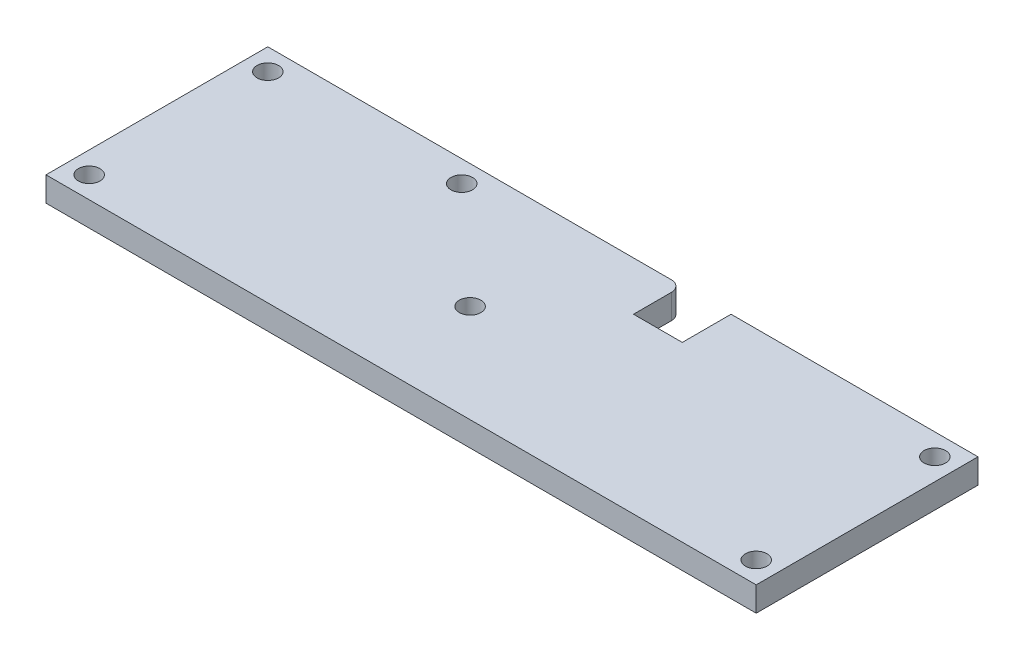
ISO-10303-21;
HEADER;
FILE_DESCRIPTION(('STEP AP214'),'2;1');
FILE_NAME('part.step','',(''),(''),'','','');
FILE_SCHEMA(('AUTOMOTIVE_DESIGN { 1 0 10303 214 1 1 1 1 }'));
ENDSEC;
DATA;
#1=APPLICATION_CONTEXT('core data for automotive mechanical design processes');
#2=APPLICATION_PROTOCOL_DEFINITION('international standard','automotive_design',2000,#1);
#3=PRODUCT_CONTEXT('',#1,'mechanical');
#4=PRODUCT('Part','Part','',(#3));
#5=PRODUCT_RELATED_PRODUCT_CATEGORY('part','',(#4));
#6=PRODUCT_DEFINITION_FORMATION('','',#4);
#7=PRODUCT_DEFINITION_CONTEXT('part definition',#1,'design');
#8=PRODUCT_DEFINITION('design','',#6,#7);
#9=PRODUCT_DEFINITION_SHAPE('','',#8);
#10=(LENGTH_UNIT() NAMED_UNIT(*) SI_UNIT(.MILLI.,.METRE.));
#11=(NAMED_UNIT(*) PLANE_ANGLE_UNIT() SI_UNIT($,.RADIAN.));
#12=(NAMED_UNIT(*) SI_UNIT($,.STERADIAN.) SOLID_ANGLE_UNIT());
#13=UNCERTAINTY_MEASURE_WITH_UNIT(LENGTH_MEASURE(1.E-05),#10,'distance_accuracy_value','');
#14=(GEOMETRIC_REPRESENTATION_CONTEXT(3) GLOBAL_UNCERTAINTY_ASSIGNED_CONTEXT((#13)) GLOBAL_UNIT_ASSIGNED_CONTEXT((#10,
#11,#12)) REPRESENTATION_CONTEXT('',''));
#15=CARTESIAN_POINT('',(0.,0.,0.));
#16=DIRECTION('',(0.,0.,1.));
#17=DIRECTION('',(1.,0.,0.));
#18=AXIS2_PLACEMENT_3D('',#15,#16,#17);
#19=CARTESIAN_POINT('',(8.86999999999997,4.5,-18.3));
#20=DIRECTION('',(0.,1.,0.));
#21=DIRECTION('',(0.,0.,1.));
#22=AXIS2_PLACEMENT_3D('',#19,#20,#21);
#23=PLANE('',#22);
#24=CARTESIAN_POINT('',(-25.55,4.5,-16.35));
#25=DIRECTION('',(0.,1.,0.));
#26=DIRECTION('',(0.,0.,1.));
#27=AXIS2_PLACEMENT_3D('',#24,#25,#26);
#28=CIRCLE('',#27,1.975);
#29=CARTESIAN_POINT('',(-25.55,4.5,-14.375));
#30=VERTEX_POINT('',#29);
#31=EDGE_CURVE('E216',#30,#30,#28,.T.);
#32=ORIENTED_EDGE('',*,*,#31,.F.);
#33=EDGE_LOOP('',(#32));
#34=FACE_BOUND('',#33,.T.);
#35=CARTESIAN_POINT('',(61.05,4.5,16.35));
#36=DIRECTION('',(0.,1.,0.));
#37=DIRECTION('',(0.,0.,1.));
#38=AXIS2_PLACEMENT_3D('',#35,#36,#37);
#39=CIRCLE('',#38,1.975);
#40=CARTESIAN_POINT('',(61.05,4.5,18.325));
#41=VERTEX_POINT('',#40);
#42=EDGE_CURVE('E204',#41,#41,#39,.T.);
#43=ORIENTED_EDGE('',*,*,#42,.F.);
#44=EDGE_LOOP('',(#43));
#45=FACE_BOUND('',#44,.T.);
#46=CARTESIAN_POINT('',(-61.05,4.5,-16.35));
#47=DIRECTION('',(0.,1.,0.));
#48=DIRECTION('',(0.,0.,1.));
#49=AXIS2_PLACEMENT_3D('',#46,#47,#48);
#50=CIRCLE('',#49,1.975);
#51=CARTESIAN_POINT('',(-61.05,4.5,-14.375));
#52=VERTEX_POINT('',#51);
#53=EDGE_CURVE('E140',#52,#52,#50,.T.);
#54=ORIENTED_EDGE('',*,*,#53,.F.);
#55=EDGE_LOOP('',(#54));
#56=FACE_BOUND('',#55,.T.);
#57=DIRECTION('',(0.,0.,1.));
#58=VECTOR('',#57,1.);
#59=CARTESIAN_POINT('',(-65.,4.5,-20.3));
#60=LINE('',#59,#58);
#61=CARTESIAN_POINT('',(-65.,4.5,-20.3));
#62=VERTEX_POINT('',#61);
#63=CARTESIAN_POINT('',(-65.,4.5,20.3));
#64=VERTEX_POINT('',#63);
#65=EDGE_CURVE('E153',#62,#64,#60,.T.);
#66=ORIENTED_EDGE('',*,*,#65,.T.);
#67=DIRECTION('',(1.,0.,0.));
#68=VECTOR('',#67,1.);
#69=CARTESIAN_POINT('',(65.,4.5,20.3));
#70=LINE('',#69,#68);
#71=CARTESIAN_POINT('',(65.,4.5,20.3));
#72=VERTEX_POINT('',#71);
#73=EDGE_CURVE('E96',#64,#72,#70,.T.);
#74=ORIENTED_EDGE('',*,*,#73,.T.);
#75=DIRECTION('',(0.,0.,-1.));
#76=VECTOR('',#75,1.);
#77=CARTESIAN_POINT('',(65.,4.5,-20.3));
#78=LINE('',#77,#76);
#79=CARTESIAN_POINT('',(65.,4.5,-20.3));
#80=VERTEX_POINT('',#79);
#81=EDGE_CURVE('E171',#72,#80,#78,.T.);
#82=ORIENTED_EDGE('',*,*,#81,.T.);
#83=DIRECTION('',(-1.,0.,0.));
#84=VECTOR('',#83,1.);
#85=CARTESIAN_POINT('',(65.,4.5,-20.3));
#86=LINE('',#85,#84);
#87=CARTESIAN_POINT('',(19.8,4.5,-20.3));
#88=VERTEX_POINT('',#87);
#89=EDGE_CURVE('E188',#80,#88,#86,.T.);
#90=ORIENTED_EDGE('',*,*,#89,.T.);
#91=DIRECTION('',(0.,0.,1.));
#92=VECTOR('',#91,1.);
#93=CARTESIAN_POINT('',(19.8,4.5,-20.3));
#94=LINE('',#93,#92);
#95=CARTESIAN_POINT('',(19.8,4.5,-11.37));
#96=VERTEX_POINT('',#95);
#97=EDGE_CURVE('E187',#88,#96,#94,.T.);
#98=ORIENTED_EDGE('',*,*,#97,.T.);
#99=DIRECTION('',(-1.,0.,0.));
#100=VECTOR('',#99,1.);
#101=CARTESIAN_POINT('',(10.87,4.5,-11.37));
#102=LINE('',#101,#100);
#103=CARTESIAN_POINT('',(10.87,4.5,-11.37));
#104=VERTEX_POINT('',#103);
#105=EDGE_CURVE('E118',#96,#104,#102,.T.);
#106=ORIENTED_EDGE('',*,*,#105,.T.);
#107=DIRECTION('',(0.,0.,-1.));
#108=VECTOR('',#107,1.);
#109=CARTESIAN_POINT('',(10.87,4.5,-18.3));
#110=LINE('',#109,#108);
#111=CARTESIAN_POINT('',(10.87,4.5,-18.3));
#112=VERTEX_POINT('',#111);
#113=EDGE_CURVE('E112',#104,#112,#110,.T.);
#114=ORIENTED_EDGE('',*,*,#113,.T.);
#115=CARTESIAN_POINT('',(8.86999999999997,4.5,-18.3));
#116=DIRECTION('',(0.,1.,0.));
#117=DIRECTION('',(0.,0.,1.));
#118=AXIS2_PLACEMENT_3D('',#115,#116,#117);
#119=CIRCLE('',#118,2.);
#120=CARTESIAN_POINT('',(8.86999999999996,4.5,-20.3));
#121=VERTEX_POINT('',#120);
#122=EDGE_CURVE('E116',#112,#121,#119,.T.);
#123=ORIENTED_EDGE('',*,*,#122,.T.);
#124=DIRECTION('',(-1.,0.,0.));
#125=VECTOR('',#124,1.);
#126=CARTESIAN_POINT('',(8.86999999999996,4.5,-20.3));
#127=LINE('',#126,#125);
#128=EDGE_CURVE('E50',#121,#62,#127,.T.);
#129=ORIENTED_EDGE('',*,*,#128,.T.);
#130=EDGE_LOOP('',(#66,#74,#82,#90,#98,#106,#114,#123,#129));
#131=FACE_BOUND('',#130,.T.);
#132=CARTESIAN_POINT('',(61.05,4.5,-16.35));
#133=DIRECTION('',(0.,1.,0.));
#134=DIRECTION('',(0.,0.,-1.));
#135=AXIS2_PLACEMENT_3D('',#132,#133,#134);
#136=CIRCLE('',#135,1.975);
#137=CARTESIAN_POINT('',(61.05,4.5,-18.325));
#138=VERTEX_POINT('',#137);
#139=EDGE_CURVE('E198',#138,#138,#136,.T.);
#140=ORIENTED_EDGE('',*,*,#139,.F.);
#141=EDGE_LOOP('',(#140));
#142=FACE_BOUND('',#141,.T.);
#143=CARTESIAN_POINT('',(-61.05,4.5,16.35));
#144=DIRECTION('',(0.,1.,0.));
#145=DIRECTION('',(0.,0.,-1.));
#146=AXIS2_PLACEMENT_3D('',#143,#144,#145);
#147=CIRCLE('',#146,1.975);
#148=CARTESIAN_POINT('',(-61.05,4.5,14.375));
#149=VERTEX_POINT('',#148);
#150=EDGE_CURVE('E210',#149,#149,#147,.T.);
#151=ORIENTED_EDGE('',*,*,#150,.F.);
#152=EDGE_LOOP('',(#151));
#153=FACE_BOUND('',#152,.T.);
#154=CARTESIAN_POINT('',(-5.32832484201151,4.5,2.33965152443094));
#155=DIRECTION('',(0.,1.,0.));
#156=DIRECTION('',(0.,0.,1.));
#157=AXIS2_PLACEMENT_3D('',#154,#155,#156);
#158=CIRCLE('',#157,1.975);
#159=CARTESIAN_POINT('',(-5.32832484201151,4.5,4.31465152443094));
#160=VERTEX_POINT('',#159);
#161=EDGE_CURVE('E222',#160,#160,#158,.T.);
#162=ORIENTED_EDGE('',*,*,#161,.F.);
#163=EDGE_LOOP('',(#162));
#164=FACE_BOUND('',#163,.T.);
#165=ADVANCED_FACE('F33',(#34,#45,#56,#131,#142,#153,#164),#23,.T.);
#166=CARTESIAN_POINT('',(8.86999999999997,0.,-18.3));
#167=DIRECTION('',(0.,1.,0.));
#168=DIRECTION('',(0.,0.,1.));
#169=AXIS2_PLACEMENT_3D('',#166,#167,#168);
#170=PLANE('',#169);
#171=CARTESIAN_POINT('',(-25.55,0.,-16.35));
#172=DIRECTION('',(0.,1.,0.));
#173=DIRECTION('',(0.,0.,1.));
#174=AXIS2_PLACEMENT_3D('',#171,#172,#173);
#175=CIRCLE('',#174,1.975);
#176=CARTESIAN_POINT('',(-25.55,0.,-14.375));
#177=VERTEX_POINT('',#176);
#178=EDGE_CURVE('E219',#177,#177,#175,.T.);
#179=ORIENTED_EDGE('',*,*,#178,.T.);
#180=EDGE_LOOP('',(#179));
#181=FACE_BOUND('',#180,.T.);
#182=CARTESIAN_POINT('',(61.05,0.,16.35));
#183=DIRECTION('',(0.,1.,0.));
#184=DIRECTION('',(0.,0.,1.));
#185=AXIS2_PLACEMENT_3D('',#182,#183,#184);
#186=CIRCLE('',#185,1.975);
#187=CARTESIAN_POINT('',(61.05,0.,18.325));
#188=VERTEX_POINT('',#187);
#189=EDGE_CURVE('E207',#188,#188,#186,.T.);
#190=ORIENTED_EDGE('',*,*,#189,.T.);
#191=EDGE_LOOP('',(#190));
#192=FACE_BOUND('',#191,.T.);
#193=CARTESIAN_POINT('',(-61.05,0.,-16.35));
#194=DIRECTION('',(0.,1.,0.));
#195=DIRECTION('',(0.,0.,1.));
#196=AXIS2_PLACEMENT_3D('',#193,#194,#195);
#197=CIRCLE('',#196,1.975);
#198=CARTESIAN_POINT('',(-61.05,0.,-14.375));
#199=VERTEX_POINT('',#198);
#200=EDGE_CURVE('E195',#199,#199,#197,.T.);
#201=ORIENTED_EDGE('',*,*,#200,.T.);
#202=EDGE_LOOP('',(#201));
#203=FACE_BOUND('',#202,.T.);
#204=DIRECTION('',(0.,0.,1.));
#205=VECTOR('',#204,1.);
#206=CARTESIAN_POINT('',(-65.,0.,-20.3));
#207=LINE('',#206,#205);
#208=CARTESIAN_POINT('',(-65.,0.,-20.3));
#209=VERTEX_POINT('',#208);
#210=CARTESIAN_POINT('',(-65.,0.,20.3));
#211=VERTEX_POINT('',#210);
#212=EDGE_CURVE('E136',#209,#211,#207,.T.);
#213=ORIENTED_EDGE('',*,*,#212,.F.);
#214=DIRECTION('',(-1.,0.,0.));
#215=VECTOR('',#214,1.);
#216=CARTESIAN_POINT('',(8.86999999999996,0.,-20.3));
#217=LINE('',#216,#215);
#218=CARTESIAN_POINT('',(8.86999999999996,0.,-20.3));
#219=VERTEX_POINT('',#218);
#220=EDGE_CURVE('E88',#219,#209,#217,.T.);
#221=ORIENTED_EDGE('',*,*,#220,.F.);
#222=CARTESIAN_POINT('',(8.86999999999997,0.,-18.3));
#223=DIRECTION('',(0.,1.,0.));
#224=DIRECTION('',(0.,0.,1.));
#225=AXIS2_PLACEMENT_3D('',#222,#223,#224);
#226=CIRCLE('',#225,2.);
#227=CARTESIAN_POINT('',(10.87,0.,-18.3));
#228=VERTEX_POINT('',#227);
#229=EDGE_CURVE('E82',#228,#219,#226,.T.);
#230=ORIENTED_EDGE('',*,*,#229,.F.);
#231=DIRECTION('',(0.,0.,-1.));
#232=VECTOR('',#231,1.);
#233=CARTESIAN_POINT('',(10.87,0.,-18.3));
#234=LINE('',#233,#232);
#235=CARTESIAN_POINT('',(10.87,0.,-11.37));
#236=VERTEX_POINT('',#235);
#237=EDGE_CURVE('E126',#236,#228,#234,.T.);
#238=ORIENTED_EDGE('',*,*,#237,.F.);
#239=DIRECTION('',(-1.,0.,0.));
#240=VECTOR('',#239,1.);
#241=CARTESIAN_POINT('',(10.87,0.,-11.37));
#242=LINE('',#241,#240);
#243=CARTESIAN_POINT('',(19.8,0.,-11.37));
#244=VERTEX_POINT('',#243);
#245=EDGE_CURVE('E148',#244,#236,#242,.T.);
#246=ORIENTED_EDGE('',*,*,#245,.F.);
#247=DIRECTION('',(0.,0.,1.));
#248=VECTOR('',#247,1.);
#249=CARTESIAN_POINT('',(19.8,0.,-20.3));
#250=LINE('',#249,#248);
#251=CARTESIAN_POINT('',(19.8,0.,-20.3));
#252=VERTEX_POINT('',#251);
#253=EDGE_CURVE('E146',#252,#244,#250,.T.);
#254=ORIENTED_EDGE('',*,*,#253,.F.);
#255=DIRECTION('',(-1.,0.,0.));
#256=VECTOR('',#255,1.);
#257=CARTESIAN_POINT('',(65.,0.,-20.3));
#258=LINE('',#257,#256);
#259=CARTESIAN_POINT('',(65.,0.,-20.3));
#260=VERTEX_POINT('',#259);
#261=EDGE_CURVE('E144',#260,#252,#258,.T.);
#262=ORIENTED_EDGE('',*,*,#261,.F.);
#263=DIRECTION('',(0.,0.,-1.));
#264=VECTOR('',#263,1.);
#265=CARTESIAN_POINT('',(65.,0.,-20.3));
#266=LINE('',#265,#264);
#267=CARTESIAN_POINT('',(65.,0.,20.3));
#268=VERTEX_POINT('',#267);
#269=EDGE_CURVE('E142',#268,#260,#266,.T.);
#270=ORIENTED_EDGE('',*,*,#269,.F.);
#271=DIRECTION('',(1.,0.,0.));
#272=VECTOR('',#271,1.);
#273=CARTESIAN_POINT('',(65.,0.,20.3));
#274=LINE('',#273,#272);
#275=EDGE_CURVE('E139',#211,#268,#274,.T.);
#276=ORIENTED_EDGE('',*,*,#275,.F.);
#277=EDGE_LOOP('',(#213,#221,#230,#238,#246,#254,#262,#270,#276));
#278=FACE_BOUND('',#277,.T.);
#279=CARTESIAN_POINT('',(61.05,0.,-16.35));
#280=DIRECTION('',(0.,1.,0.));
#281=DIRECTION('',(0.,0.,-1.));
#282=AXIS2_PLACEMENT_3D('',#279,#280,#281);
#283=CIRCLE('',#282,1.975);
#284=CARTESIAN_POINT('',(61.05,0.,-18.325));
#285=VERTEX_POINT('',#284);
#286=EDGE_CURVE('E201',#285,#285,#283,.T.);
#287=ORIENTED_EDGE('',*,*,#286,.T.);
#288=EDGE_LOOP('',(#287));
#289=FACE_BOUND('',#288,.T.);
#290=CARTESIAN_POINT('',(-61.05,0.,16.35));
#291=DIRECTION('',(0.,1.,0.));
#292=DIRECTION('',(0.,0.,-1.));
#293=AXIS2_PLACEMENT_3D('',#290,#291,#292);
#294=CIRCLE('',#293,1.975);
#295=CARTESIAN_POINT('',(-61.05,0.,14.375));
#296=VERTEX_POINT('',#295);
#297=EDGE_CURVE('E213',#296,#296,#294,.T.);
#298=ORIENTED_EDGE('',*,*,#297,.T.);
#299=EDGE_LOOP('',(#298));
#300=FACE_BOUND('',#299,.T.);
#301=CARTESIAN_POINT('',(-5.32832484201151,0.,2.33965152443094));
#302=DIRECTION('',(0.,1.,0.));
#303=DIRECTION('',(0.,0.,1.));
#304=AXIS2_PLACEMENT_3D('',#301,#302,#303);
#305=CIRCLE('',#304,1.975);
#306=CARTESIAN_POINT('',(-5.32832484201151,0.,4.31465152443094));
#307=VERTEX_POINT('',#306);
#308=EDGE_CURVE('E225',#307,#307,#305,.T.);
#309=ORIENTED_EDGE('',*,*,#308,.T.);
#310=EDGE_LOOP('',(#309));
#311=FACE_BOUND('',#310,.T.);
#312=ADVANCED_FACE('F175',(#181,#192,#203,#278,#289,#300,#311),#170,.F.);
#313=CARTESIAN_POINT('',(-65.,4.5,-20.3));
#314=DIRECTION('',(1.,0.,0.));
#315=DIRECTION('',(0.,0.,-1.));
#316=AXIS2_PLACEMENT_3D('',#313,#314,#315);
#317=PLANE('',#316);
#318=ORIENTED_EDGE('',*,*,#212,.T.);
#319=DIRECTION('',(0.,-1.,0.));
#320=VECTOR('',#319,1.);
#321=CARTESIAN_POINT('',(-65.,4.5,20.3));
#322=LINE('',#321,#320);
#323=EDGE_CURVE('E11',#64,#211,#322,.T.);
#324=ORIENTED_EDGE('',*,*,#323,.F.);
#325=ORIENTED_EDGE('',*,*,#65,.F.);
#326=DIRECTION('',(0.,-1.,0.));
#327=VECTOR('',#326,1.);
#328=CARTESIAN_POINT('',(-65.,4.5,-20.3));
#329=LINE('',#328,#327);
#330=EDGE_CURVE('E132',#62,#209,#329,.T.);
#331=ORIENTED_EDGE('',*,*,#330,.T.);
#332=EDGE_LOOP('',(#318,#324,#325,#331));
#333=FACE_BOUND('',#332,.T.);
#334=ADVANCED_FACE('F35',(#333),#317,.F.);
#335=CARTESIAN_POINT('',(65.,4.5,20.3));
#336=DIRECTION('',(0.,0.,-1.));
#337=DIRECTION('',(-1.,0.,0.));
#338=AXIS2_PLACEMENT_3D('',#335,#336,#337);
#339=PLANE('',#338);
#340=ORIENTED_EDGE('',*,*,#275,.T.);
#341=DIRECTION('',(0.,-1.,0.));
#342=VECTOR('',#341,1.);
#343=CARTESIAN_POINT('',(65.,4.5,20.3));
#344=LINE('',#343,#342);
#345=EDGE_CURVE('E42',#72,#268,#344,.T.);
#346=ORIENTED_EDGE('',*,*,#345,.F.);
#347=ORIENTED_EDGE('',*,*,#73,.F.);
#348=ORIENTED_EDGE('',*,*,#323,.T.);
#349=EDGE_LOOP('',(#340,#346,#347,#348));
#350=FACE_BOUND('',#349,.T.);
#351=ADVANCED_FACE('F264',(#350),#339,.F.);
#352=CARTESIAN_POINT('',(65.,4.5,-20.3));
#353=DIRECTION('',(-1.,0.,0.));
#354=DIRECTION('',(0.,0.,1.));
#355=AXIS2_PLACEMENT_3D('',#352,#353,#354);
#356=PLANE('',#355);
#357=ORIENTED_EDGE('',*,*,#269,.T.);
#358=DIRECTION('',(0.,-1.,0.));
#359=VECTOR('',#358,1.);
#360=CARTESIAN_POINT('',(65.,4.5,-20.3));
#361=LINE('',#360,#359);
#362=EDGE_CURVE('E163',#80,#260,#361,.T.);
#363=ORIENTED_EDGE('',*,*,#362,.F.);
#364=ORIENTED_EDGE('',*,*,#81,.F.);
#365=ORIENTED_EDGE('',*,*,#345,.T.);
#366=EDGE_LOOP('',(#357,#363,#364,#365));
#367=FACE_BOUND('',#366,.T.);
#368=ADVANCED_FACE('F169',(#367),#356,.F.);
#369=CARTESIAN_POINT('',(65.,4.5,-20.3));
#370=DIRECTION('',(0.,0.,1.));
#371=DIRECTION('',(1.,0.,0.));
#372=AXIS2_PLACEMENT_3D('',#369,#370,#371);
#373=PLANE('',#372);
#374=ORIENTED_EDGE('',*,*,#261,.T.);
#375=DIRECTION('',(0.,-1.,0.));
#376=VECTOR('',#375,1.);
#377=CARTESIAN_POINT('',(19.8,4.5,-20.3));
#378=LINE('',#377,#376);
#379=EDGE_CURVE('E160',#88,#252,#378,.T.);
#380=ORIENTED_EDGE('',*,*,#379,.F.);
#381=ORIENTED_EDGE('',*,*,#89,.F.);
#382=ORIENTED_EDGE('',*,*,#362,.T.);
#383=EDGE_LOOP('',(#374,#380,#381,#382));
#384=FACE_BOUND('',#383,.T.);
#385=ADVANCED_FACE('F181',(#384),#373,.F.);
#386=CARTESIAN_POINT('',(19.8,4.5,-20.3));
#387=DIRECTION('',(1.,0.,0.));
#388=DIRECTION('',(0.,0.,-1.));
#389=AXIS2_PLACEMENT_3D('',#386,#387,#388);
#390=PLANE('',#389);
#391=ORIENTED_EDGE('',*,*,#253,.T.);
#392=DIRECTION('',(0.,-1.,0.));
#393=VECTOR('',#392,1.);
#394=CARTESIAN_POINT('',(19.8,4.5,-11.37));
#395=LINE('',#394,#393);
#396=EDGE_CURVE('E157',#96,#244,#395,.T.);
#397=ORIENTED_EDGE('',*,*,#396,.F.);
#398=ORIENTED_EDGE('',*,*,#97,.F.);
#399=ORIENTED_EDGE('',*,*,#379,.T.);
#400=EDGE_LOOP('',(#391,#397,#398,#399));
#401=FACE_BOUND('',#400,.T.);
#402=ADVANCED_FACE('F185',(#401),#390,.F.);
#403=CARTESIAN_POINT('',(10.87,4.5,-11.37));
#404=DIRECTION('',(0.,0.,1.));
#405=DIRECTION('',(1.,0.,0.));
#406=AXIS2_PLACEMENT_3D('',#403,#404,#405);
#407=PLANE('',#406);
#408=ORIENTED_EDGE('',*,*,#245,.T.);
#409=DIRECTION('',(0.,-1.,0.));
#410=VECTOR('',#409,1.);
#411=CARTESIAN_POINT('',(10.87,4.5,-11.37));
#412=LINE('',#411,#410);
#413=EDGE_CURVE('E127',#104,#236,#412,.T.);
#414=ORIENTED_EDGE('',*,*,#413,.F.);
#415=ORIENTED_EDGE('',*,*,#105,.F.);
#416=ORIENTED_EDGE('',*,*,#396,.T.);
#417=EDGE_LOOP('',(#408,#414,#415,#416));
#418=FACE_BOUND('',#417,.T.);
#419=ADVANCED_FACE('F255',(#418),#407,.F.);
#420=CARTESIAN_POINT('',(10.87,4.5,-18.3));
#421=DIRECTION('',(-1.,0.,0.));
#422=DIRECTION('',(0.,0.,1.));
#423=AXIS2_PLACEMENT_3D('',#420,#421,#422);
#424=PLANE('',#423);
#425=ORIENTED_EDGE('',*,*,#237,.T.);
#426=DIRECTION('',(0.,-1.,0.));
#427=VECTOR('',#426,1.);
#428=CARTESIAN_POINT('',(10.87,4.5,-18.3));
#429=LINE('',#428,#427);
#430=EDGE_CURVE('E123',#112,#228,#429,.T.);
#431=ORIENTED_EDGE('',*,*,#430,.F.);
#432=ORIENTED_EDGE('',*,*,#113,.F.);
#433=ORIENTED_EDGE('',*,*,#413,.T.);
#434=EDGE_LOOP('',(#425,#431,#432,#433));
#435=FACE_BOUND('',#434,.T.);
#436=ADVANCED_FACE('F124',(#435),#424,.F.);
#437=CARTESIAN_POINT('',(8.86999999999997,4.5,-18.3));
#438=DIRECTION('',(0.,-1.,0.));
#439=DIRECTION('',(0.,0.,-1.));
#440=AXIS2_PLACEMENT_3D('',#437,#438,#439);
#441=CYLINDRICAL_SURFACE('',#440,2.);
#442=ORIENTED_EDGE('',*,*,#229,.T.);
#443=DIRECTION('',(0.,-1.,0.));
#444=VECTOR('',#443,1.);
#445=CARTESIAN_POINT('',(8.86999999999996,4.5,-20.3));
#446=LINE('',#445,#444);
#447=EDGE_CURVE('E128',#121,#219,#446,.T.);
#448=ORIENTED_EDGE('',*,*,#447,.F.);
#449=ORIENTED_EDGE('',*,*,#122,.F.);
#450=ORIENTED_EDGE('',*,*,#430,.T.);
#451=EDGE_LOOP('',(#442,#448,#449,#450));
#452=FACE_BOUND('',#451,.T.);
#453=ADVANCED_FACE('F130',(#452),#441,.T.);
#454=CARTESIAN_POINT('',(8.86999999999996,4.5,-20.3));
#455=DIRECTION('',(0.,0.,1.));
#456=DIRECTION('',(1.,0.,0.));
#457=AXIS2_PLACEMENT_3D('',#454,#455,#456);
#458=PLANE('',#457);
#459=ORIENTED_EDGE('',*,*,#220,.T.);
#460=ORIENTED_EDGE('',*,*,#330,.F.);
#461=ORIENTED_EDGE('',*,*,#128,.F.);
#462=ORIENTED_EDGE('',*,*,#447,.T.);
#463=EDGE_LOOP('',(#459,#460,#461,#462));
#464=FACE_BOUND('',#463,.T.);
#465=ADVANCED_FACE('F248',(#464),#458,.F.);
#466=CARTESIAN_POINT('',(-61.05,4.5,-16.35));
#467=DIRECTION('',(0.,-1.,0.));
#468=DIRECTION('',(0.,0.,-1.));
#469=AXIS2_PLACEMENT_3D('',#466,#467,#468);
#470=CYLINDRICAL_SURFACE('',#469,1.975);
#471=ORIENTED_EDGE('',*,*,#53,.T.);
#472=EDGE_LOOP('',(#471));
#473=FACE_BOUND('',#472,.T.);
#474=ORIENTED_EDGE('',*,*,#200,.F.);
#475=EDGE_LOOP('',(#474));
#476=FACE_BOUND('',#475,.T.);
#477=ADVANCED_FACE('F245',(#473,#476),#470,.F.);
#478=CARTESIAN_POINT('',(61.05,4.5,-16.35));
#479=DIRECTION('',(0.,-1.,0.));
#480=DIRECTION('',(0.,0.,-1.));
#481=AXIS2_PLACEMENT_3D('',#478,#479,#480);
#482=CYLINDRICAL_SURFACE('',#481,1.975);
#483=ORIENTED_EDGE('',*,*,#139,.T.);
#484=EDGE_LOOP('',(#483));
#485=FACE_BOUND('',#484,.T.);
#486=ORIENTED_EDGE('',*,*,#286,.F.);
#487=EDGE_LOOP('',(#486));
#488=FACE_BOUND('',#487,.T.);
#489=ADVANCED_FACE('F333',(#485,#488),#482,.F.);
#490=CARTESIAN_POINT('',(61.05,4.5,16.35));
#491=DIRECTION('',(0.,-1.,0.));
#492=DIRECTION('',(0.,0.,-1.));
#493=AXIS2_PLACEMENT_3D('',#490,#491,#492);
#494=CYLINDRICAL_SURFACE('',#493,1.975);
#495=ORIENTED_EDGE('',*,*,#42,.T.);
#496=EDGE_LOOP('',(#495));
#497=FACE_BOUND('',#496,.T.);
#498=ORIENTED_EDGE('',*,*,#189,.F.);
#499=EDGE_LOOP('',(#498));
#500=FACE_BOUND('',#499,.T.);
#501=ADVANCED_FACE('F341',(#497,#500),#494,.F.);
#502=CARTESIAN_POINT('',(-61.05,4.5,16.35));
#503=DIRECTION('',(0.,-1.,0.));
#504=DIRECTION('',(0.,0.,-1.));
#505=AXIS2_PLACEMENT_3D('',#502,#503,#504);
#506=CYLINDRICAL_SURFACE('',#505,1.975);
#507=ORIENTED_EDGE('',*,*,#150,.T.);
#508=EDGE_LOOP('',(#507));
#509=FACE_BOUND('',#508,.T.);
#510=ORIENTED_EDGE('',*,*,#297,.F.);
#511=EDGE_LOOP('',(#510));
#512=FACE_BOUND('',#511,.T.);
#513=ADVANCED_FACE('F349',(#509,#512),#506,.F.);
#514=CARTESIAN_POINT('',(-25.55,4.5,-16.35));
#515=DIRECTION('',(0.,-1.,0.));
#516=DIRECTION('',(0.,0.,-1.));
#517=AXIS2_PLACEMENT_3D('',#514,#515,#516);
#518=CYLINDRICAL_SURFACE('',#517,1.975);
#519=ORIENTED_EDGE('',*,*,#31,.T.);
#520=EDGE_LOOP('',(#519));
#521=FACE_BOUND('',#520,.T.);
#522=ORIENTED_EDGE('',*,*,#178,.F.);
#523=EDGE_LOOP('',(#522));
#524=FACE_BOUND('',#523,.T.);
#525=ADVANCED_FACE('F358',(#521,#524),#518,.F.);
#526=CARTESIAN_POINT('',(-5.32832484201151,4.5,2.33965152443094));
#527=DIRECTION('',(0.,-1.,0.));
#528=DIRECTION('',(0.,0.,-1.));
#529=AXIS2_PLACEMENT_3D('',#526,#527,#528);
#530=CYLINDRICAL_SURFACE('',#529,1.975);
#531=ORIENTED_EDGE('',*,*,#161,.T.);
#532=EDGE_LOOP('',(#531));
#533=FACE_BOUND('',#532,.T.);
#534=ORIENTED_EDGE('',*,*,#308,.F.);
#535=EDGE_LOOP('',(#534));
#536=FACE_BOUND('',#535,.T.);
#537=ADVANCED_FACE('F231',(#533,#536),#530,.F.);
#538=CLOSED_SHELL('',(#165,#312,#334,#351,#368,#385,#402,#419,#436,#453,#465,#477,#489,#501,
#513,#525,#537));
#539=MANIFOLD_SOLID_BREP('B2',#538);
#540=ADVANCED_BREP_SHAPE_REPRESENTATION('',(#18,#539),#14);
#541=SHAPE_DEFINITION_REPRESENTATION(#9,#540);
ENDSEC;
END-ISO-10303-21;
